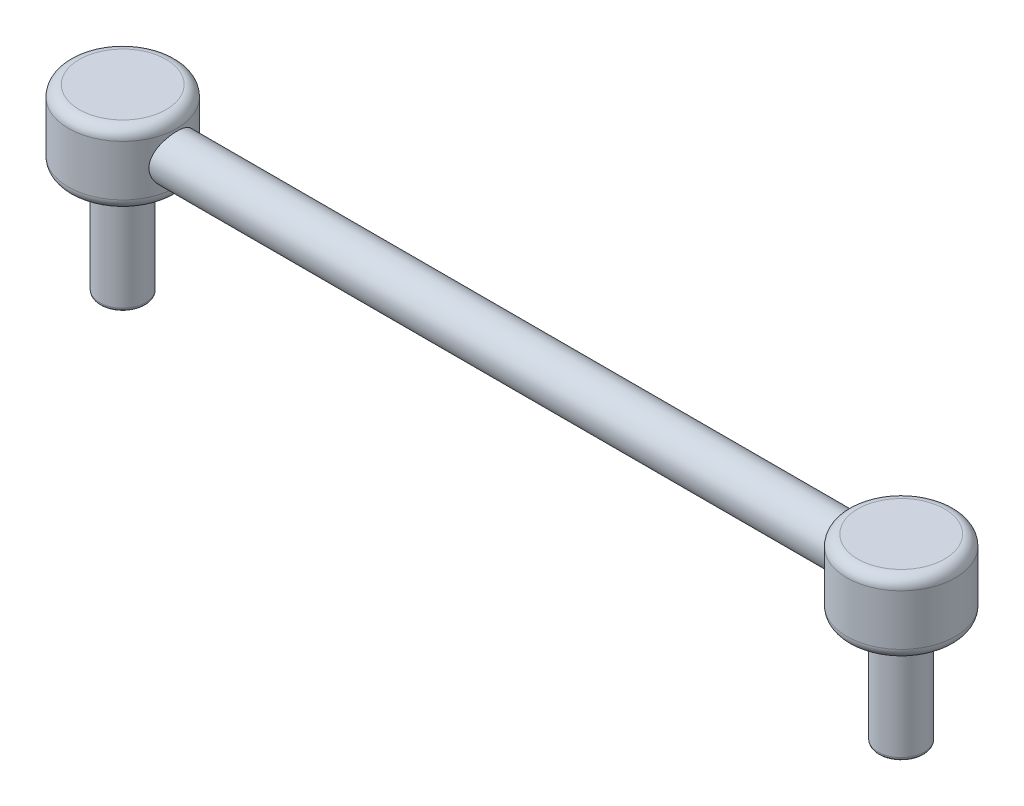
ISO-10303-21;
HEADER;
FILE_DESCRIPTION(('STEP AP214'),'2;1');
FILE_NAME('part.step','',(''),(''),'','','');
FILE_SCHEMA(('AUTOMOTIVE_DESIGN { 1 0 10303 214 1 1 1 1 }'));
ENDSEC;
DATA;
#1=APPLICATION_CONTEXT('core data for automotive mechanical design processes');
#2=APPLICATION_PROTOCOL_DEFINITION('international standard','automotive_design',2000,#1);
#3=PRODUCT_CONTEXT('',#1,'mechanical');
#4=PRODUCT('Part','Part','',(#3));
#5=PRODUCT_RELATED_PRODUCT_CATEGORY('part','',(#4));
#6=PRODUCT_DEFINITION_FORMATION('','',#4);
#7=PRODUCT_DEFINITION_CONTEXT('part definition',#1,'design');
#8=PRODUCT_DEFINITION('design','',#6,#7);
#9=PRODUCT_DEFINITION_SHAPE('','',#8);
#10=(LENGTH_UNIT() NAMED_UNIT(*) SI_UNIT(.MILLI.,.METRE.));
#11=(NAMED_UNIT(*) PLANE_ANGLE_UNIT() SI_UNIT($,.RADIAN.));
#12=(NAMED_UNIT(*) SI_UNIT($,.STERADIAN.) SOLID_ANGLE_UNIT());
#13=UNCERTAINTY_MEASURE_WITH_UNIT(LENGTH_MEASURE(1.E-05),#10,'distance_accuracy_value','');
#14=(GEOMETRIC_REPRESENTATION_CONTEXT(3) GLOBAL_UNCERTAINTY_ASSIGNED_CONTEXT((#13)) GLOBAL_UNIT_ASSIGNED_CONTEXT((#10,
#11,#12)) REPRESENTATION_CONTEXT('',''));
#15=CARTESIAN_POINT('',(0.,0.,0.));
#16=DIRECTION('',(0.,0.,1.));
#17=DIRECTION('',(1.,0.,0.));
#18=AXIS2_PLACEMENT_3D('',#15,#16,#17);
#19=CARTESIAN_POINT('',(215.,10.,0.));
#20=DIRECTION('',(-1.,0.,0.));
#21=DIRECTION('',(0.,0.,1.));
#22=AXIS2_PLACEMENT_3D('',#19,#20,#21);
#23=CYLINDRICAL_SURFACE('',#22,6.35);
#24=CARTESIAN_POINT('',(13.5896100017624,10.,6.35));
#25=CARTESIAN_POINT('',(13.5896113094437,9.83086352622694,6.34999876356606));
#26=CARTESIAN_POINT('',(13.5927785412169,9.66167017677892,6.34323262541982));
#27=CARTESIAN_POINT('',(13.6053429396222,9.32451913397667,6.31623766035786));
#28=CARTESIAN_POINT('',(13.6147440891614,9.15656230005494,6.29600022647629));
#29=CARTESIAN_POINT('',(13.6394794877049,8.82286775935023,6.24223319052705));
#30=CARTESIAN_POINT('',(13.6548261253184,8.65713543881912,6.20867583012741));
#31=CARTESIAN_POINT('',(13.6909442360392,8.32936880678683,6.128618984761));
#32=CARTESIAN_POINT('',(13.711717997605,8.16733608671491,6.08211403963384));
#33=CARTESIAN_POINT('',(13.7579192579716,7.84882512246492,5.97686722537761));
#34=CARTESIAN_POINT('',(13.7833247851926,7.6923246517361,5.91818295641476));
#35=CARTESIAN_POINT('',(13.8380953503697,7.38498804053212,5.78895801361124));
#36=CARTESIAN_POINT('',(13.8674618994433,7.23415409003246,5.71841281231731));
#37=CARTESIAN_POINT('',(13.9602332085387,6.79163355347174,5.48989532133151));
#38=CARTESIAN_POINT('',(14.0283702027229,6.50953358580105,5.31490955843452));
#39=CARTESIAN_POINT('',(14.174425468546,5.96132749451217,4.91262386633669));
#40=CARTESIAN_POINT('',(14.2526824060501,5.69711283944272,4.68286864761116));
#41=CARTESIAN_POINT('',(14.3686427293222,5.33162252409677,4.30805181606605));
#42=CARTESIAN_POINT('',(14.4070847950056,5.21486084539071,4.17798160450761));
#43=CARTESIAN_POINT('',(14.4825333310115,4.99228280587774,3.90842455364738));
#44=CARTESIAN_POINT('',(14.5195402908693,4.88646269185083,3.76894097067419));
#45=CARTESIAN_POINT('',(14.592813062566,4.68189619707006,3.47474096686708));
#46=CARTESIAN_POINT('',(14.6289683318541,4.58369158527939,3.31962009046381));
#47=CARTESIAN_POINT('',(14.6976577010502,4.40081957068304,3.00090247782828));
#48=CARTESIAN_POINT('',(14.7301931934452,4.31614695676281,2.83730903663549));
#49=CARTESIAN_POINT('',(14.7907194528053,4.16108065777849,2.50270187731384));
#50=CARTESIAN_POINT('',(14.8187108745772,4.09068491503268,2.33168923281107));
#51=CARTESIAN_POINT('',(14.8693242317261,3.96488422902279,1.98346679317648));
#52=CARTESIAN_POINT('',(14.8919465565929,3.90947819832083,1.80625744864189));
#53=CARTESIAN_POINT('',(14.9300844597461,3.81682881512302,1.45664907196768));
#54=CARTESIAN_POINT('',(14.9459154317356,3.77877251883917,1.28449970482809));
#55=CARTESIAN_POINT('',(14.9717050526133,3.71706755556464,0.93720787175087));
#56=CARTESIAN_POINT('',(14.981664094615,3.69341792407413,0.762065606989506));
#57=CARTESIAN_POINT('',(14.995422243264,3.66080391479675,0.410237555122603));
#58=CARTESIAN_POINT('',(14.9992234400147,3.65183455420383,0.233552312217178));
#59=CARTESIAN_POINT('',(15.0005615467805,3.64867335934497,-0.11997085933381));
#60=CARTESIAN_POINT('',(14.9980987089564,3.65448093022899,-0.29680878154675));
#61=CARTESIAN_POINT('',(14.987333256547,3.67997007390185,-0.638066594723042));
#62=CARTESIAN_POINT('',(14.9794086438766,3.69875377204193,-0.802566436688636));
#63=CARTESIAN_POINT('',(14.9583234171704,3.74904319585376,-1.12932358168615));
#64=CARTESIAN_POINT('',(14.9451611069026,3.78055304294667,-1.29158014059779));
#65=CARTESIAN_POINT('',(14.9139329353451,3.85597264695467,-1.61264143970686));
#66=CARTESIAN_POINT('',(14.8958686829744,3.89987833548845,-1.7714472940577));
#67=CARTESIAN_POINT('',(14.8552669361953,3.99970552998521,-2.0847074458953));
#68=CARTESIAN_POINT('',(14.8327277393335,4.05563160967159,-2.23916006161368));
#69=CARTESIAN_POINT('',(14.7833456821613,4.17993871092227,-2.54500131405314));
#70=CARTESIAN_POINT('',(14.7564437927867,4.24849262291129,-2.69631020067636));
#71=CARTESIAN_POINT('',(14.6992206081673,4.39694154254053,-2.99261190538116));
#72=CARTESIAN_POINT('',(14.668898065403,4.47684069057856,-3.13760239223012));
#73=CARTESIAN_POINT('',(14.5738428123365,4.73268829131111,-3.56186620937073));
#74=CARTESIAN_POINT('',(14.5049898509129,4.9248661706927,-3.83062558026854));
#75=CARTESIAN_POINT('',(14.3573257077404,5.36310772922074,-4.35271832191701));
#76=CARTESIAN_POINT('',(14.2781544619707,5.61206620301163,-4.60352438192189));
#77=CARTESIAN_POINT('',(14.1614823924338,6.01420434094145,-4.94642102404336));
#78=CARTESIAN_POINT('',(14.1229122459255,6.15314380309812,-5.05523391607315));
#79=CARTESIAN_POINT('',(14.0475168296569,6.43989499063994,-5.26110873594743));
#80=CARTESIAN_POINT('',(14.0106909279494,6.58770345806378,-5.35817493979546));
#81=CARTESIAN_POINT('',(13.9385838003021,6.89677777051735,-5.54311190664521));
#82=CARTESIAN_POINT('',(13.9034033654801,7.05833475082131,-5.63053566307354));
#83=CARTESIAN_POINT('',(13.837207572775,7.38905368018079,-5.79130765467297));
#84=CARTESIAN_POINT('',(13.8061905045337,7.5582124679705,-5.8646616751966));
#85=CARTESIAN_POINT('',(13.7494028884521,7.90298512939882,-5.99658921820021));
#86=CARTESIAN_POINT('',(13.7236303199901,8.07859648606163,-6.05516843526599));
#87=CARTESIAN_POINT('',(13.6782848353722,8.43500792820991,-6.15691762001397));
#88=CARTESIAN_POINT('',(13.6587113454844,8.61580753182705,-6.20008901375483));
#89=CARTESIAN_POINT('',(13.627606332412,8.96897461430324,-6.26814560157545));
#90=CARTESIAN_POINT('',(13.6156275032417,9.14110593986352,-6.29405377761598));
#91=CARTESIAN_POINT('',(13.5981822423047,9.48723781877201,-6.33165646602368));
#92=CARTESIAN_POINT('',(13.592715351499,9.66123823949155,-6.34335198026971));
#93=CARTESIAN_POINT('',(13.5884973088965,10.0096391519991,-6.3523826700149));
#94=CARTESIAN_POINT('',(13.5897441191581,10.1840395063216,-6.34972220326639));
#95=CARTESIAN_POINT('',(13.5989024104813,10.5318516209362,-6.33008457341875));
#96=CARTESIAN_POINT('',(13.6068136785779,10.7052634126398,-6.3131078677998));
#97=CARTESIAN_POINT('',(13.628258671511,11.0380947295905,-6.26667108386934));
#98=CARTESIAN_POINT('',(13.6413779999518,11.1976702606288,-6.23812841020291));
#99=CARTESIAN_POINT('',(13.6727530617345,11.513741853457,-6.16905678024264));
#100=CARTESIAN_POINT('',(13.6910104415354,11.6702369108995,-6.12852398156905));
#101=CARTESIAN_POINT('',(13.732112045029,11.979098206227,-6.03586474966169));
#102=CARTESIAN_POINT('',(13.7549554240145,12.1314651986135,-5.98374045130598));
#103=CARTESIAN_POINT('',(13.8045950283467,12.431299439306,-5.86831333125208));
#104=CARTESIAN_POINT('',(13.8313927749555,12.5787647750533,-5.80500620561725));
#105=CARTESIAN_POINT('',(13.8894329890204,12.8741443352658,-5.66477272796777));
#106=CARTESIAN_POINT('',(13.9208162071352,13.0218098605672,-5.58738094322806));
#107=CARTESIAN_POINT('',(13.9862526530586,13.3102113311169,-5.42150218055687));
#108=CARTESIAN_POINT('',(14.0203067903274,13.4509448892102,-5.33301141717302));
#109=CARTESIAN_POINT('',(14.0902070268334,13.724777169616,-5.14549100137995));
#110=CARTESIAN_POINT('',(14.1260534985069,13.8578742926801,-5.04645915372969));
#111=CARTESIAN_POINT('',(14.1986540333356,14.1157733521387,-4.83842543014553));
#112=CARTESIAN_POINT('',(14.2354081381218,14.2405749070607,-4.72942309626482));
#113=CARTESIAN_POINT('',(14.312077598224,14.491494535674,-4.49235330962767));
#114=CARTESIAN_POINT('',(14.3519966154304,14.6168260742366,-4.36345295401995));
#115=CARTESIAN_POINT('',(14.4307852739528,14.8562163773952,-4.0953570516498));
#116=CARTESIAN_POINT('',(14.4696552353114,14.9702786089086,-3.95616469432864));
#117=CARTESIAN_POINT('',(14.5453357190406,15.1864777671337,-3.66815822147476));
#118=CARTESIAN_POINT('',(14.5821451867281,15.2886086152065,-3.51933926097832));
#119=CARTESIAN_POINT('',(14.6526725840993,15.4800760812924,-3.21307708941512));
#120=CARTESIAN_POINT('',(14.686391845076,15.5694182182245,-3.05563763928718));
#121=CARTESIAN_POINT('',(14.749967054503,15.734971433373,-2.73234777909184));
#122=CARTESIAN_POINT('',(14.7798055248766,15.811123585088,-2.56646370187599));
#123=CARTESIAN_POINT('',(14.8345823294189,15.9490621269947,-2.22811991155073));
#124=CARTESIAN_POINT('',(14.8595227487113,16.0108546322184,-2.05566303401109));
#125=CARTESIAN_POINT('',(14.9037790997812,16.119443668738,-1.70543562764489));
#126=CARTESIAN_POINT('',(14.9230966471664,16.1662445079461,-1.52766664135462));
#127=CARTESIAN_POINT('',(14.9555295578416,16.2443277551651,-1.16819984332459));
#128=CARTESIAN_POINT('',(14.9686454050104,16.2756113738942,-0.986502339258985));
#129=CARTESIAN_POINT('',(14.9875655204031,16.3206013901279,-0.63386750435903));
#130=CARTESIAN_POINT('',(14.9938271583123,16.3354085904751,-0.463094325902962));
#131=CARTESIAN_POINT('',(15.0004901291828,16.3511618500637,-0.120798179277007));
#132=CARTESIAN_POINT('',(15.0008917212519,16.3521085221623,0.0507247554061957));
#133=CARTESIAN_POINT('',(14.9958241022287,16.3401316344909,0.393166905024614));
#134=CARTESIAN_POINT('',(14.9903558874365,16.3272104285575,0.564086217474903));
#135=CARTESIAN_POINT('',(14.9736991094118,16.2876455695949,0.90404461657659));
#136=CARTESIAN_POINT('',(14.9625105885938,16.2610020183129,1.07308371715974));
#137=CARTESIAN_POINT('',(14.9352399195887,16.1955419253147,1.401699959065));
#138=CARTESIAN_POINT('',(14.9193585087615,16.1572230275295,1.56139336435283));
#139=CARTESIAN_POINT('',(14.8829595373424,16.0684941670028,1.8768967750127));
#140=CARTESIAN_POINT('',(14.8624404607368,16.0180802501699,2.0327054919794));
#141=CARTESIAN_POINT('',(14.8172611105836,15.9056224196665,2.33940093902285));
#142=CARTESIAN_POINT('',(14.792601776969,15.843581145301,2.49028877698723));
#143=CARTESIAN_POINT('',(14.739697778611,15.7083328536734,2.78638469840984));
#144=CARTESIAN_POINT('',(14.7114517484811,15.6351215820574,2.93159059117741));
#145=CARTESIAN_POINT('',(14.6506744201713,15.4745347529807,3.22191163242717));
#146=CARTESIAN_POINT('',(14.6180073160019,15.3866693286758,3.36672739041029));
#147=CARTESIAN_POINT('',(14.5502296525041,15.1999282290929,3.64853826066724));
#148=CARTESIAN_POINT('',(14.5151182532278,15.1010487619186,3.7855306548198));
#149=CARTESIAN_POINT('',(14.4432866054612,14.8929100106969,4.05097290559423));
#150=CARTESIAN_POINT('',(14.4065661019448,14.783649078066,4.17942139991494));
#151=CARTESIAN_POINT('',(14.3323879336324,14.5553807997191,4.42711802903429));
#152=CARTESIAN_POINT('',(14.2949302403258,14.4363730764847,4.54636580711771));
#153=CARTESIAN_POINT('',(14.2175208983081,14.1804673708818,4.78316809401146));
#154=CARTESIAN_POINT('',(14.1775806861422,14.0428992108827,4.90000334338687));
#155=CARTESIAN_POINT('',(14.0990188521438,13.7581315832848,5.12166909944051));
#156=CARTESIAN_POINT('',(14.0603968047202,13.6109352699271,5.22650350702054));
#157=CARTESIAN_POINT('',(13.9855534103872,13.3075416924585,5.42359867795229));
#158=CARTESIAN_POINT('',(13.9493345588263,13.1513353778834,5.51584647384448));
#159=CARTESIAN_POINT('',(13.8804858963883,12.8310476404857,5.68688057946337));
#160=CARTESIAN_POINT('',(13.8478544579241,12.6669698378468,5.76567300286226));
#161=CARTESIAN_POINT('',(13.7873345017601,12.3323970328523,5.90892896814799));
#162=CARTESIAN_POINT('',(13.7594325521512,12.1619219424083,5.97343325452798));
#163=CARTESIAN_POINT('',(13.7092570642642,11.8153772985184,6.08770644134171));
#164=CARTESIAN_POINT('',(13.6869807530887,11.6393105495894,6.13748260340558));
#165=CARTESIAN_POINT('',(13.648928570795,11.2833489887038,6.22164606458007));
#166=CARTESIAN_POINT('',(13.6331355694963,11.1034656026553,6.2560739378791));
#167=CARTESIAN_POINT('',(13.6085992442422,10.7410169027455,6.30927063921159));
#168=CARTESIAN_POINT('',(13.5998504828244,10.5584537684461,6.32805154555881));
#169=CARTESIAN_POINT('',(13.5930679467907,10.3129115219451,6.34259501014289));
#170=CARTESIAN_POINT('',(13.591772156603,10.250371536304,6.34537102210961));
#171=CARTESIAN_POINT('',(13.590042936507,10.1252236326975,6.34907375775433));
#172=CARTESIAN_POINT('',(13.589609517648,10.0626157138718,6.35000045773802));
#173=CARTESIAN_POINT('',(13.5896100017624,10.,6.35));
#174=B_SPLINE_CURVE_WITH_KNOTS('',3,(#24,#25,#26,#27,#28,#29,#30,#31,#32,#33,#34,#35,#36,#37,
#38,#39,#40,#41,#42,#43,#44,#45,#46,#47,#48,#49,#50,#51,#52,#53,#54,#55,#56,#57,#58,#59,#60,#61,
#62,#63,#64,#65,#66,#67,#68,#69,#70,#71,#72,#73,#74,#75,#76,#77,#78,#79,#80,#81,#82,#83,#84,#85,
#86,#87,#88,#89,#90,#91,#92,#93,#94,#95,#96,#97,#98,#99,#100,#101,#102,#103,#104,#105,#106,#107,
#108,#109,#110,#111,#112,#113,#114,#115,#116,#117,#118,#119,#120,#121,#122,#123,#124,#125,#126,
#127,#128,#129,#130,#131,#132,#133,#134,#135,#136,#137,#138,#139,#140,#141,#142,#143,#144,#145,
#146,#147,#148,#149,#150,#151,#152,#153,#154,#155,#156,#157,#158,#159,#160,#161,#162,#163,#164,
#165,#166,#167,#168,#169,#170,#171,#172,#173),.UNSPECIFIED.,.T.,.F.,(4,2,2,2,2,2,2,2,2,2,2,2,2,
2,2,2,2,2,2,2,2,2,2,2,2,2,2,2,2,2,2,2,2,2,2,2,2,2,2,2,2,2,2,2,2,2,2,2,2,2,2,2,2,2,2,2,2,2,2,2,2,
2,2,2,2,2,2,2,2,2,2,2,2,2,4),(0.,0.507344230518969,1.01501292062567,1.5237451790304,
2.03269230208143,2.53928515805514,3.04607182715324,4.058398458171,5.12974788730966,
5.6661664023611,6.20240029821705,6.76305979482418,7.3235028608734,7.88386509448701,
8.4441866653705,8.97453898178849,9.50485578818724,10.0349925560697,10.5651079834671,
11.0617984725882,11.5586499463296,12.055338539955,12.5522164577546,13.0564853279068,
13.5609387041924,14.569217202591,15.6505265313173,16.1919586865422,16.7331931541693,
17.2935822178896,17.8537403581995,18.4136822682224,18.9735723398256,19.496324984309,
20.0190407767785,20.5415979080044,21.0641383413763,21.5514983148599,22.0390146382151,
22.5264412469333,23.0140558619771,23.5224512146578,24.0310204361713,24.5396957781239,
25.0483944953996,25.6002493868821,26.1519339722441,26.7038984078417,27.2556239225207,
27.8097540373472,28.3636477425584,28.9173821412257,29.4710733284265,29.9850080952994,
30.4989201379589,31.0127449665734,31.5265659853747,32.0209850149994,32.5155659003731,
33.0100346560355,33.5046922139704,34.021656865822,34.5388000507373,35.056025496014,
35.5732709842486,36.127182801967,36.6809140549988,37.2352115546695,37.7892565260496,
38.3417006226413,38.8938718837367,39.4445746610188,39.9948519411363,40.1826725421458,
40.3704955495908),.UNSPECIFIED.);
#175=CARTESIAN_POINT('',(13.5896100017624,10.,6.35));
#176=VERTEX_POINT('',#175);
#177=EDGE_CURVE('E89',#176,#176,#174,.T.);
#178=ORIENTED_EDGE('',*,*,#177,.T.);
#179=EDGE_LOOP('',(#178));
#180=FACE_BOUND('',#179,.T.);
#181=CARTESIAN_POINT('',(201.410389998238,10.,6.35));
#182=CARTESIAN_POINT('',(201.410388690556,9.83086352622694,6.34999876356606));
#183=CARTESIAN_POINT('',(201.407221458783,9.66167017677892,6.34323262541982));
#184=CARTESIAN_POINT('',(201.394657060378,9.32451913397668,6.31623766035787));
#185=CARTESIAN_POINT('',(201.385255910839,9.15656230005494,6.29600022647629));
#186=CARTESIAN_POINT('',(201.360520512295,8.82286775935023,6.24223319052705));
#187=CARTESIAN_POINT('',(201.345173874682,8.65713543881912,6.20867583012741));
#188=CARTESIAN_POINT('',(201.309055763961,8.32936880678683,6.128618984761));
#189=CARTESIAN_POINT('',(201.288282002395,8.16733608671491,6.08211403963384));
#190=CARTESIAN_POINT('',(201.242080742028,7.84882512246492,5.97686722537761));
#191=CARTESIAN_POINT('',(201.216675214807,7.6923246517361,5.91818295641476));
#192=CARTESIAN_POINT('',(201.16190464963,7.38498804053212,5.78895801361124));
#193=CARTESIAN_POINT('',(201.132538100557,7.23415409003246,5.71841281231731));
#194=CARTESIAN_POINT('',(201.039766791461,6.79163355347174,5.48989532133152));
#195=CARTESIAN_POINT('',(200.971629797277,6.50953358580105,5.31490955843452));
#196=CARTESIAN_POINT('',(200.825574531454,5.96132749451217,4.91262386633669));
#197=CARTESIAN_POINT('',(200.74731759395,5.69711283944272,4.68286864761116));
#198=CARTESIAN_POINT('',(200.631357270678,5.33162252409678,4.30805181606605));
#199=CARTESIAN_POINT('',(200.592915204994,5.21486084539071,4.17798160450761));
#200=CARTESIAN_POINT('',(200.517466668988,4.99228280587775,3.90842455364738));
#201=CARTESIAN_POINT('',(200.480459709131,4.88646269185083,3.76894097067419));
#202=CARTESIAN_POINT('',(200.407186937434,4.68189619707006,3.47474096686709));
#203=CARTESIAN_POINT('',(200.371031668146,4.58369158527939,3.31962009046381));
#204=CARTESIAN_POINT('',(200.30234229895,4.40081957068304,3.00090247782828));
#205=CARTESIAN_POINT('',(200.269806806555,4.31614695676281,2.83730903663549));
#206=CARTESIAN_POINT('',(200.209280547195,4.16108065777848,2.50270187731383));
#207=CARTESIAN_POINT('',(200.181289125423,4.09068491503268,2.33168923281107));
#208=CARTESIAN_POINT('',(200.130675768274,3.96488422902279,1.98346679317648));
#209=CARTESIAN_POINT('',(200.108053443407,3.90947819832083,1.80625744864189));
#210=CARTESIAN_POINT('',(200.069915540254,3.81682881512302,1.45664907196769));
#211=CARTESIAN_POINT('',(200.054084568264,3.77877251883917,1.28449970482809));
#212=CARTESIAN_POINT('',(200.028294947387,3.71706755556464,0.937207871750872));
#213=CARTESIAN_POINT('',(200.018335905385,3.69341792407413,0.762065606989507));
#214=CARTESIAN_POINT('',(200.004577756736,3.66080391479675,0.410237555122602));
#215=CARTESIAN_POINT('',(200.000776559985,3.65183455420383,0.233552312217177));
#216=CARTESIAN_POINT('',(199.999438453219,3.64867335934497,-0.119970859333812));
#217=CARTESIAN_POINT('',(200.001901291044,3.65448093022899,-0.296808781546752));
#218=CARTESIAN_POINT('',(200.012666743453,3.67997007390185,-0.638066594723044));
#219=CARTESIAN_POINT('',(200.020591356123,3.69875377204193,-0.802566436688638));
#220=CARTESIAN_POINT('',(200.04167658283,3.74904319585376,-1.12932358168615));
#221=CARTESIAN_POINT('',(200.054838893097,3.78055304294667,-1.29158014059779));
#222=CARTESIAN_POINT('',(200.086067064655,3.85597264695467,-1.61264143970686));
#223=CARTESIAN_POINT('',(200.104131317026,3.89987833548845,-1.7714472940577));
#224=CARTESIAN_POINT('',(200.144733063805,3.99970552998521,-2.0847074458953));
#225=CARTESIAN_POINT('',(200.167272260666,4.05563160967159,-2.23916006161369));
#226=CARTESIAN_POINT('',(200.216654317839,4.17993871092227,-2.54500131405314));
#227=CARTESIAN_POINT('',(200.243556207213,4.24849262291129,-2.69631020067636));
#228=CARTESIAN_POINT('',(200.300779391833,4.39694154254053,-2.99261190538116));
#229=CARTESIAN_POINT('',(200.331101934597,4.47684069057856,-3.13760239223011));
#230=CARTESIAN_POINT('',(200.426157187664,4.73268829131111,-3.56186620937073));
#231=CARTESIAN_POINT('',(200.495010149087,4.9248661706927,-3.83062558026853));
#232=CARTESIAN_POINT('',(200.64267429226,5.36310772922075,-4.35271832191702));
#233=CARTESIAN_POINT('',(200.721845538029,5.61206620301163,-4.6035243819219));
#234=CARTESIAN_POINT('',(200.838517607566,6.01420434094145,-4.94642102404336));
#235=CARTESIAN_POINT('',(200.877087754074,6.15314380309813,-5.05523391607315));
#236=CARTESIAN_POINT('',(200.952483170343,6.43989499063994,-5.26110873594743));
#237=CARTESIAN_POINT('',(200.989309072051,6.58770345806378,-5.35817493979546));
#238=CARTESIAN_POINT('',(201.061416199698,6.89677777051735,-5.54311190664521));
#239=CARTESIAN_POINT('',(201.09659663452,7.05833475082131,-5.63053566307354));
#240=CARTESIAN_POINT('',(201.162792427225,7.38905368018079,-5.79130765467297));
#241=CARTESIAN_POINT('',(201.193809495466,7.5582124679705,-5.8646616751966));
#242=CARTESIAN_POINT('',(201.250597111548,7.90298512939882,-5.99658921820021));
#243=CARTESIAN_POINT('',(201.27636968001,8.07859648606163,-6.05516843526599));
#244=CARTESIAN_POINT('',(201.321715164628,8.43500792820991,-6.15691762001397));
#245=CARTESIAN_POINT('',(201.341288654516,8.61580753182705,-6.20008901375483));
#246=CARTESIAN_POINT('',(201.372393667588,8.96897461430324,-6.26814560157545));
#247=CARTESIAN_POINT('',(201.384372496758,9.14110593986352,-6.29405377761598));
#248=CARTESIAN_POINT('',(201.401817757695,9.48723781877201,-6.33165646602368));
#249=CARTESIAN_POINT('',(201.407284648501,9.66123823949155,-6.34335198026971));
#250=CARTESIAN_POINT('',(201.411502691103,10.0096391519991,-6.3523826700149));
#251=CARTESIAN_POINT('',(201.410255880842,10.1840395063216,-6.34972220326639));
#252=CARTESIAN_POINT('',(201.401097589519,10.5318516209361,-6.33008457341875));
#253=CARTESIAN_POINT('',(201.393186321422,10.7052634126398,-6.3131078677998));
#254=CARTESIAN_POINT('',(201.371741328489,11.0380947295905,-6.26667108386934));
#255=CARTESIAN_POINT('',(201.358622000048,11.1976702606288,-6.23812841020291));
#256=CARTESIAN_POINT('',(201.327246938265,11.513741853457,-6.16905678024264));
#257=CARTESIAN_POINT('',(201.308989558465,11.6702369108995,-6.12852398156905));
#258=CARTESIAN_POINT('',(201.267887954971,11.979098206227,-6.03586474966169));
#259=CARTESIAN_POINT('',(201.245044575985,12.1314651986135,-5.98374045130599));
#260=CARTESIAN_POINT('',(201.195404971653,12.431299439306,-5.86831333125208));
#261=CARTESIAN_POINT('',(201.168607225044,12.5787647750533,-5.80500620561725));
#262=CARTESIAN_POINT('',(201.11056701098,12.8741443352658,-5.66477272796777));
#263=CARTESIAN_POINT('',(201.079183792865,13.0218098605672,-5.58738094322806));
#264=CARTESIAN_POINT('',(201.013747346941,13.3102113311169,-5.42150218055687));
#265=CARTESIAN_POINT('',(200.979693209673,13.4509448892102,-5.33301141717302));
#266=CARTESIAN_POINT('',(200.909792973167,13.724777169616,-5.14549100137995));
#267=CARTESIAN_POINT('',(200.873946501493,13.8578742926801,-5.04645915372969));
#268=CARTESIAN_POINT('',(200.801345966664,14.1157733521387,-4.83842543014553));
#269=CARTESIAN_POINT('',(200.764591861878,14.2405749070607,-4.72942309626482));
#270=CARTESIAN_POINT('',(200.687922401776,14.491494535674,-4.49235330962767));
#271=CARTESIAN_POINT('',(200.64800338457,14.6168260742366,-4.36345295401994));
#272=CARTESIAN_POINT('',(200.569214726047,14.8562163773952,-4.09535705164979));
#273=CARTESIAN_POINT('',(200.530344764689,14.9702786089086,-3.95616469432864));
#274=CARTESIAN_POINT('',(200.454664280959,15.1864777671337,-3.66815822147476));
#275=CARTESIAN_POINT('',(200.417854813272,15.2886086152065,-3.51933926097832));
#276=CARTESIAN_POINT('',(200.347327415901,15.4800760812924,-3.21307708941513));
#277=CARTESIAN_POINT('',(200.313608154924,15.5694182182245,-3.05563763928718));
#278=CARTESIAN_POINT('',(200.250032945497,15.734971433373,-2.73234777909184));
#279=CARTESIAN_POINT('',(200.220194475123,15.811123585088,-2.56646370187599));
#280=CARTESIAN_POINT('',(200.165417670581,15.9490621269947,-2.22811991155073));
#281=CARTESIAN_POINT('',(200.140477251289,16.0108546322184,-2.05566303401109));
#282=CARTESIAN_POINT('',(200.096220900219,16.119443668738,-1.70543562764489));
#283=CARTESIAN_POINT('',(200.076903352834,16.1662445079461,-1.52766664135462));
#284=CARTESIAN_POINT('',(200.044470442158,16.2443277551651,-1.16819984332459));
#285=CARTESIAN_POINT('',(200.03135459499,16.2756113738942,-0.986502339258985));
#286=CARTESIAN_POINT('',(200.012434479597,16.3206013901279,-0.633867504359032));
#287=CARTESIAN_POINT('',(200.006172841688,16.3354085904751,-0.463094325902964));
#288=CARTESIAN_POINT('',(199.999509870817,16.3511618500637,-0.12079817927701));
#289=CARTESIAN_POINT('',(199.999108278748,16.3521085221623,0.0507247554061937));
#290=CARTESIAN_POINT('',(200.004175897771,16.3401316344909,0.393166905024613));
#291=CARTESIAN_POINT('',(200.009644112564,16.3272104285576,0.564086217474904));
#292=CARTESIAN_POINT('',(200.026300890588,16.2876455695949,0.90404461657659));
#293=CARTESIAN_POINT('',(200.037489411406,16.2610020183129,1.07308371715974));
#294=CARTESIAN_POINT('',(200.064760080411,16.1955419253147,1.401699959065));
#295=CARTESIAN_POINT('',(200.080641491238,16.1572230275295,1.56139336435282));
#296=CARTESIAN_POINT('',(200.117040462658,16.0684941670028,1.87689677501269));
#297=CARTESIAN_POINT('',(200.137559539263,16.0180802501699,2.0327054919794));
#298=CARTESIAN_POINT('',(200.182738889416,15.9056224196665,2.33940093902285));
#299=CARTESIAN_POINT('',(200.207398223031,15.843581145301,2.49028877698723));
#300=CARTESIAN_POINT('',(200.260302221389,15.7083328536734,2.78638469840984));
#301=CARTESIAN_POINT('',(200.288548251519,15.6351215820574,2.93159059117742));
#302=CARTESIAN_POINT('',(200.349325579829,15.4745347529807,3.22191163242717));
#303=CARTESIAN_POINT('',(200.381992683998,15.3866693286758,3.36672739041029));
#304=CARTESIAN_POINT('',(200.449770347496,15.1999282290929,3.64853826066724));
#305=CARTESIAN_POINT('',(200.484881746772,15.1010487619186,3.7855306548198));
#306=CARTESIAN_POINT('',(200.556713394539,14.8929100106969,4.05097290559423));
#307=CARTESIAN_POINT('',(200.593433898055,14.783649078066,4.17942139991495));
#308=CARTESIAN_POINT('',(200.667612066368,14.5553807997191,4.42711802903429));
#309=CARTESIAN_POINT('',(200.705069759674,14.4363730764847,4.54636580711771));
#310=CARTESIAN_POINT('',(200.782479101692,14.1804673708818,4.78316809401146));
#311=CARTESIAN_POINT('',(200.822419313858,14.0428992108827,4.90000334338687));
#312=CARTESIAN_POINT('',(200.900981147856,13.7581315832848,5.12166909944052));
#313=CARTESIAN_POINT('',(200.93960319528,13.6109352699271,5.22650350702054));
#314=CARTESIAN_POINT('',(201.014446589613,13.3075416924585,5.42359867795229));
#315=CARTESIAN_POINT('',(201.050665441174,13.1513353778834,5.51584647384448));
#316=CARTESIAN_POINT('',(201.119514103612,12.8310476404857,5.68688057946337));
#317=CARTESIAN_POINT('',(201.152145542076,12.6669698378468,5.76567300286226));
#318=CARTESIAN_POINT('',(201.21266549824,12.3323970328523,5.90892896814799));
#319=CARTESIAN_POINT('',(201.240567447849,12.1619219424083,5.97343325452798));
#320=CARTESIAN_POINT('',(201.290742935736,11.8153772985184,6.08770644134172));
#321=CARTESIAN_POINT('',(201.313019246911,11.6393105495894,6.13748260340558));
#322=CARTESIAN_POINT('',(201.351071429205,11.2833489887038,6.22164606458007));
#323=CARTESIAN_POINT('',(201.366864430504,11.1034656026553,6.2560739378791));
#324=CARTESIAN_POINT('',(201.391400755758,10.7410169027455,6.30927063921159));
#325=CARTESIAN_POINT('',(201.400149517176,10.5584537684461,6.32805154555881));
#326=CARTESIAN_POINT('',(201.406932053209,10.3129115219451,6.34259501014289));
#327=CARTESIAN_POINT('',(201.408227843397,10.250371536304,6.34537102210961));
#328=CARTESIAN_POINT('',(201.409957063493,10.1252236326975,6.34907375775433));
#329=CARTESIAN_POINT('',(201.410390482352,10.0626157138718,6.35000045773802));
#330=CARTESIAN_POINT('',(201.410389998238,10.,6.35));
#331=B_SPLINE_CURVE_WITH_KNOTS('',3,(#181,#182,#183,#184,#185,#186,#187,#188,#189,#190,#191,
#192,#193,#194,#195,#196,#197,#198,#199,#200,#201,#202,#203,#204,#205,#206,#207,#208,#209,#210,
#211,#212,#213,#214,#215,#216,#217,#218,#219,#220,#221,#222,#223,#224,#225,#226,#227,#228,#229,
#230,#231,#232,#233,#234,#235,#236,#237,#238,#239,#240,#241,#242,#243,#244,#245,#246,#247,#248,
#249,#250,#251,#252,#253,#254,#255,#256,#257,#258,#259,#260,#261,#262,#263,#264,#265,#266,#267,
#268,#269,#270,#271,#272,#273,#274,#275,#276,#277,#278,#279,#280,#281,#282,#283,#284,#285,#286,
#287,#288,#289,#290,#291,#292,#293,#294,#295,#296,#297,#298,#299,#300,#301,#302,#303,#304,#305,
#306,#307,#308,#309,#310,#311,#312,#313,#314,#315,#316,#317,#318,#319,#320,#321,#322,#323,#324,
#325,#326,#327,#328,#329,#330),.UNSPECIFIED.,.T.,.F.,(4,2,2,2,2,2,2,2,2,2,2,2,2,2,2,2,2,2,2,2,2,
2,2,2,2,2,2,2,2,2,2,2,2,2,2,2,2,2,2,2,2,2,2,2,2,2,2,2,2,2,2,2,2,2,2,2,2,2,2,2,2,2,2,2,2,2,2,2,2,
2,2,2,2,2,4),(0.,0.507344230518965,1.01501292062566,1.5237451790304,2.03269230208143,
2.53928515805514,3.04607182715324,4.058398458171,5.12974788730965,5.66616640236109,
6.20240029821704,6.76305979482418,7.3235028608734,7.88386509448701,8.44418666537049,
8.97453898178849,9.50485578818724,10.0349925560697,10.5651079834671,11.0617984725882,
11.5586499463296,12.055338539955,12.5522164577546,13.0564853279068,13.5609387041924,
14.569217202591,15.6505265313173,16.1919586865422,16.7331931541693,17.2935822178896,
17.8537403581995,18.4136822682223,18.9735723398256,19.496324984309,20.0190407767785,
20.5415979080044,21.0641383413763,21.5514983148599,22.0390146382151,22.5264412469333,
23.0140558619771,23.5224512146577,24.0310204361713,24.5396957781239,25.0483944953996,
25.6002493868821,26.1519339722441,26.7038984078417,27.2556239225207,27.8097540373472,
28.3636477425584,28.9173821412257,29.4710733284265,29.9850080952994,30.4989201379589,
31.0127449665733,31.5265659853747,32.0209850149994,32.5155659003731,33.0100346560355,
33.5046922139704,34.021656865822,34.5388000507373,35.056025496014,35.5732709842486,
36.127182801967,36.6809140549988,37.2352115546695,37.7892565260496,38.3417006226413,
38.8938718837367,39.4445746610188,39.9948519411363,40.1826725421458,40.3704955495908),.UNSPECIFIED.);
#332=CARTESIAN_POINT('',(201.410389998238,10.,6.35));
#333=VERTEX_POINT('',#332);
#334=EDGE_CURVE('E81',#333,#333,#331,.T.);
#335=ORIENTED_EDGE('',*,*,#334,.F.);
#336=EDGE_LOOP('',(#335));
#337=FACE_BOUND('',#336,.T.);
#338=ADVANCED_FACE('F37',(#180,#337),#23,.T.);
#339=CARTESIAN_POINT('',(0.,20.,0.));
#340=DIRECTION('',(0.,-1.,0.));
#341=DIRECTION('',(0.,0.,-1.));
#342=AXIS2_PLACEMENT_3D('',#339,#340,#341);
#343=CYLINDRICAL_SURFACE('',#342,15.);
#344=CARTESIAN_POINT('',(0.,3.,0.));
#345=DIRECTION('',(0.,1.,0.));
#346=DIRECTION('',(0.,0.,1.));
#347=AXIS2_PLACEMENT_3D('',#344,#345,#346);
#348=CIRCLE('',#347,15.);
#349=CARTESIAN_POINT('',(0.,3.,15.));
#350=VERTEX_POINT('',#349);
#351=EDGE_CURVE('E66',#350,#350,#348,.T.);
#352=ORIENTED_EDGE('',*,*,#351,.T.);
#353=EDGE_LOOP('',(#352));
#354=FACE_BOUND('',#353,.T.);
#355=CARTESIAN_POINT('',(0.,17.,0.));
#356=DIRECTION('',(0.,1.,0.));
#357=DIRECTION('',(0.,0.,1.));
#358=AXIS2_PLACEMENT_3D('',#355,#356,#357);
#359=CIRCLE('',#358,15.);
#360=CARTESIAN_POINT('',(0.,17.,15.));
#361=VERTEX_POINT('',#360);
#362=EDGE_CURVE('E69',#361,#361,#359,.F.);
#363=ORIENTED_EDGE('',*,*,#362,.T.);
#364=EDGE_LOOP('',(#363));
#365=FACE_BOUND('',#364,.T.);
#366=ORIENTED_EDGE('',*,*,#177,.F.);
#367=EDGE_LOOP('',(#366));
#368=FACE_BOUND('',#367,.T.);
#369=ADVANCED_FACE('F118',(#354,#365,#368),#343,.T.);
#370=CARTESIAN_POINT('',(0.,-30.,0.));
#371=DIRECTION('',(0.,1.,0.));
#372=DIRECTION('',(0.,0.,1.));
#373=AXIS2_PLACEMENT_3D('',#370,#371,#372);
#374=CYLINDRICAL_SURFACE('',#373,6.35);
#375=CARTESIAN_POINT('',(0.,-29.,0.));
#376=DIRECTION('',(0.,1.,0.));
#377=DIRECTION('',(0.,0.,1.));
#378=AXIS2_PLACEMENT_3D('',#375,#376,#377);
#379=CIRCLE('',#378,6.35);
#380=CARTESIAN_POINT('',(0.,-29.,6.35));
#381=VERTEX_POINT('',#380);
#382=EDGE_CURVE('E44',#381,#381,#379,.T.);
#383=ORIENTED_EDGE('',*,*,#382,.T.);
#384=EDGE_LOOP('',(#383));
#385=FACE_BOUND('',#384,.T.);
#386=CARTESIAN_POINT('',(0.,0.,0.));
#387=DIRECTION('',(0.,1.,0.));
#388=DIRECTION('',(0.,0.,1.));
#389=AXIS2_PLACEMENT_3D('',#386,#387,#388);
#390=CIRCLE('',#389,6.35);
#391=CARTESIAN_POINT('',(0.,0.,6.35));
#392=VERTEX_POINT('',#391);
#393=EDGE_CURVE('E131',#392,#392,#390,.T.);
#394=ORIENTED_EDGE('',*,*,#393,.F.);
#395=EDGE_LOOP('',(#394));
#396=FACE_BOUND('',#395,.T.);
#397=ADVANCED_FACE('F123',(#385,#396),#374,.T.);
#398=CARTESIAN_POINT('',(0.,-30.,0.));
#399=DIRECTION('',(0.,1.,0.));
#400=DIRECTION('',(0.,0.,1.));
#401=AXIS2_PLACEMENT_3D('',#398,#399,#400);
#402=PLANE('',#401);
#403=CARTESIAN_POINT('',(0.,-30.,0.));
#404=DIRECTION('',(0.,1.,0.));
#405=DIRECTION('',(0.,0.,1.));
#406=AXIS2_PLACEMENT_3D('',#403,#404,#405);
#407=CIRCLE('',#406,5.35);
#408=CARTESIAN_POINT('',(0.,-30.,5.35));
#409=VERTEX_POINT('',#408);
#410=EDGE_CURVE('E10',#409,#409,#407,.F.);
#411=ORIENTED_EDGE('',*,*,#410,.T.);
#412=EDGE_LOOP('',(#411));
#413=FACE_BOUND('',#412,.T.);
#414=ADVANCED_FACE('F177',(#413),#402,.F.);
#415=CARTESIAN_POINT('',(0.,20.,0.));
#416=DIRECTION('',(0.,1.,0.));
#417=DIRECTION('',(0.,0.,1.));
#418=AXIS2_PLACEMENT_3D('',#415,#416,#417);
#419=PLANE('',#418);
#420=CARTESIAN_POINT('',(0.,20.,0.));
#421=DIRECTION('',(0.,1.,0.));
#422=DIRECTION('',(0.,0.,1.));
#423=AXIS2_PLACEMENT_3D('',#420,#421,#422);
#424=CIRCLE('',#423,12.);
#425=CARTESIAN_POINT('',(0.,20.,12.));
#426=VERTEX_POINT('',#425);
#427=EDGE_CURVE('E60',#426,#426,#424,.T.);
#428=ORIENTED_EDGE('',*,*,#427,.T.);
#429=EDGE_LOOP('',(#428));
#430=FACE_BOUND('',#429,.T.);
#431=ADVANCED_FACE('F179',(#430),#419,.T.);
#432=CARTESIAN_POINT('',(0.,0.,0.));
#433=DIRECTION('',(0.,1.,0.));
#434=DIRECTION('',(0.,0.,1.));
#435=AXIS2_PLACEMENT_3D('',#432,#433,#434);
#436=PLANE('',#435);
#437=CARTESIAN_POINT('',(0.,0.,0.));
#438=DIRECTION('',(0.,1.,0.));
#439=DIRECTION('',(0.,0.,1.));
#440=AXIS2_PLACEMENT_3D('',#437,#438,#439);
#441=CIRCLE('',#440,12.);
#442=CARTESIAN_POINT('',(0.,0.,12.));
#443=VERTEX_POINT('',#442);
#444=EDGE_CURVE('E63',#443,#443,#441,.F.);
#445=ORIENTED_EDGE('',*,*,#444,.T.);
#446=EDGE_LOOP('',(#445));
#447=FACE_BOUND('',#446,.T.);
#448=ORIENTED_EDGE('',*,*,#393,.T.);
#449=EDGE_LOOP('',(#448));
#450=FACE_BOUND('',#449,.T.);
#451=ADVANCED_FACE('F104',(#447,#450),#436,.F.);
#452=CARTESIAN_POINT('',(215.,20.,0.));
#453=DIRECTION('',(0.,-1.,0.));
#454=DIRECTION('',(0.,0.,-1.));
#455=AXIS2_PLACEMENT_3D('',#452,#453,#454);
#456=CYLINDRICAL_SURFACE('',#455,15.);
#457=CARTESIAN_POINT('',(215.,3.,0.));
#458=DIRECTION('',(0.,1.,0.));
#459=DIRECTION('',(0.,0.,1.));
#460=AXIS2_PLACEMENT_3D('',#457,#458,#459);
#461=CIRCLE('',#460,15.);
#462=CARTESIAN_POINT('',(215.,3.,15.));
#463=VERTEX_POINT('',#462);
#464=EDGE_CURVE('E75',#463,#463,#461,.T.);
#465=ORIENTED_EDGE('',*,*,#464,.T.);
#466=EDGE_LOOP('',(#465));
#467=FACE_BOUND('',#466,.T.);
#468=CARTESIAN_POINT('',(215.,17.,0.));
#469=DIRECTION('',(0.,1.,0.));
#470=DIRECTION('',(0.,0.,1.));
#471=AXIS2_PLACEMENT_3D('',#468,#469,#470);
#472=CIRCLE('',#471,15.);
#473=CARTESIAN_POINT('',(215.,17.,15.));
#474=VERTEX_POINT('',#473);
#475=EDGE_CURVE('E78',#474,#474,#472,.F.);
#476=ORIENTED_EDGE('',*,*,#475,.T.);
#477=EDGE_LOOP('',(#476));
#478=FACE_BOUND('',#477,.T.);
#479=ORIENTED_EDGE('',*,*,#334,.T.);
#480=EDGE_LOOP('',(#479));
#481=FACE_BOUND('',#480,.T.);
#482=ADVANCED_FACE('F98',(#467,#478,#481),#456,.T.);
#483=CARTESIAN_POINT('',(215.,-30.,0.));
#484=DIRECTION('',(0.,1.,0.));
#485=DIRECTION('',(0.,0.,1.));
#486=AXIS2_PLACEMENT_3D('',#483,#484,#485);
#487=CYLINDRICAL_SURFACE('',#486,6.35);
#488=CARTESIAN_POINT('',(215.,-29.,0.));
#489=DIRECTION('',(0.,1.,0.));
#490=DIRECTION('',(0.,0.,1.));
#491=AXIS2_PLACEMENT_3D('',#488,#489,#490);
#492=CIRCLE('',#491,6.35);
#493=CARTESIAN_POINT('',(215.,-29.,6.35));
#494=VERTEX_POINT('',#493);
#495=EDGE_CURVE('E52',#494,#494,#492,.T.);
#496=ORIENTED_EDGE('',*,*,#495,.T.);
#497=EDGE_LOOP('',(#496));
#498=FACE_BOUND('',#497,.T.);
#499=CARTESIAN_POINT('',(215.,0.,0.));
#500=DIRECTION('',(0.,1.,0.));
#501=DIRECTION('',(0.,0.,1.));
#502=AXIS2_PLACEMENT_3D('',#499,#500,#501);
#503=CIRCLE('',#502,6.35);
#504=CARTESIAN_POINT('',(215.,0.,6.35));
#505=VERTEX_POINT('',#504);
#506=EDGE_CURVE('E133',#505,#505,#503,.T.);
#507=ORIENTED_EDGE('',*,*,#506,.F.);
#508=EDGE_LOOP('',(#507));
#509=FACE_BOUND('',#508,.T.);
#510=ADVANCED_FACE('F103',(#498,#509),#487,.T.);
#511=CARTESIAN_POINT('',(215.,-30.,0.));
#512=DIRECTION('',(0.,1.,0.));
#513=DIRECTION('',(0.,0.,1.));
#514=AXIS2_PLACEMENT_3D('',#511,#512,#513);
#515=PLANE('',#514);
#516=CARTESIAN_POINT('',(215.,-30.,0.));
#517=DIRECTION('',(0.,1.,0.));
#518=DIRECTION('',(0.,0.,1.));
#519=AXIS2_PLACEMENT_3D('',#516,#517,#518);
#520=CIRCLE('',#519,5.35);
#521=CARTESIAN_POINT('',(215.,-30.,5.35));
#522=VERTEX_POINT('',#521);
#523=EDGE_CURVE('E48',#522,#522,#520,.F.);
#524=ORIENTED_EDGE('',*,*,#523,.T.);
#525=EDGE_LOOP('',(#524));
#526=FACE_BOUND('',#525,.T.);
#527=ADVANCED_FACE('F108',(#526),#515,.F.);
#528=CARTESIAN_POINT('',(215.,20.,0.));
#529=DIRECTION('',(0.,1.,0.));
#530=DIRECTION('',(0.,0.,1.));
#531=AXIS2_PLACEMENT_3D('',#528,#529,#530);
#532=PLANE('',#531);
#533=CARTESIAN_POINT('',(215.,20.,0.));
#534=DIRECTION('',(0.,1.,0.));
#535=DIRECTION('',(0.,0.,1.));
#536=AXIS2_PLACEMENT_3D('',#533,#534,#535);
#537=CIRCLE('',#536,12.);
#538=CARTESIAN_POINT('',(215.,20.,12.));
#539=VERTEX_POINT('',#538);
#540=EDGE_CURVE('E57',#539,#539,#537,.T.);
#541=ORIENTED_EDGE('',*,*,#540,.T.);
#542=EDGE_LOOP('',(#541));
#543=FACE_BOUND('',#542,.T.);
#544=ADVANCED_FACE('F110',(#543),#532,.T.);
#545=CARTESIAN_POINT('',(215.,0.,0.));
#546=DIRECTION('',(0.,1.,0.));
#547=DIRECTION('',(0.,0.,1.));
#548=AXIS2_PLACEMENT_3D('',#545,#546,#547);
#549=PLANE('',#548);
#550=CARTESIAN_POINT('',(215.,0.,0.));
#551=DIRECTION('',(0.,1.,0.));
#552=DIRECTION('',(0.,0.,1.));
#553=AXIS2_PLACEMENT_3D('',#550,#551,#552);
#554=CIRCLE('',#553,12.);
#555=CARTESIAN_POINT('',(215.,0.,12.));
#556=VERTEX_POINT('',#555);
#557=EDGE_CURVE('E72',#556,#556,#554,.F.);
#558=ORIENTED_EDGE('',*,*,#557,.T.);
#559=EDGE_LOOP('',(#558));
#560=FACE_BOUND('',#559,.T.);
#561=ORIENTED_EDGE('',*,*,#506,.T.);
#562=EDGE_LOOP('',(#561));
#563=FACE_BOUND('',#562,.T.);
#564=ADVANCED_FACE('F106',(#560,#563),#549,.F.);
#565=CARTESIAN_POINT('',(215.,3.,0.));
#566=DIRECTION('',(0.,1.,0.));
#567=DIRECTION('',(0.,0.,1.));
#568=AXIS2_PLACEMENT_3D('',#565,#566,#567);
#569=TOROIDAL_SURFACE('',#568,12.,3.);
#570=ORIENTED_EDGE('',*,*,#557,.F.);
#571=EDGE_LOOP('',(#570));
#572=FACE_BOUND('',#571,.T.);
#573=ORIENTED_EDGE('',*,*,#464,.F.);
#574=EDGE_LOOP('',(#573));
#575=FACE_BOUND('',#574,.T.);
#576=ADVANCED_FACE('F141',(#572,#575),#569,.T.);
#577=CARTESIAN_POINT('',(0.,3.,0.));
#578=DIRECTION('',(0.,1.,0.));
#579=DIRECTION('',(0.,0.,1.));
#580=AXIS2_PLACEMENT_3D('',#577,#578,#579);
#581=TOROIDAL_SURFACE('',#580,12.,3.);
#582=ORIENTED_EDGE('',*,*,#444,.F.);
#583=EDGE_LOOP('',(#582));
#584=FACE_BOUND('',#583,.T.);
#585=ORIENTED_EDGE('',*,*,#351,.F.);
#586=EDGE_LOOP('',(#585));
#587=FACE_BOUND('',#586,.T.);
#588=ADVANCED_FACE('F147',(#584,#587),#581,.T.);
#589=CARTESIAN_POINT('',(0.,17.,0.));
#590=DIRECTION('',(0.,1.,0.));
#591=DIRECTION('',(0.,0.,1.));
#592=AXIS2_PLACEMENT_3D('',#589,#590,#591);
#593=TOROIDAL_SURFACE('',#592,12.,3.);
#594=ORIENTED_EDGE('',*,*,#362,.F.);
#595=EDGE_LOOP('',(#594));
#596=FACE_BOUND('',#595,.T.);
#597=ORIENTED_EDGE('',*,*,#427,.F.);
#598=EDGE_LOOP('',(#597));
#599=FACE_BOUND('',#598,.T.);
#600=ADVANCED_FACE('F161',(#596,#599),#593,.T.);
#601=CARTESIAN_POINT('',(215.,17.,0.));
#602=DIRECTION('',(0.,1.,0.));
#603=DIRECTION('',(0.,0.,1.));
#604=AXIS2_PLACEMENT_3D('',#601,#602,#603);
#605=TOROIDAL_SURFACE('',#604,12.,3.);
#606=ORIENTED_EDGE('',*,*,#475,.F.);
#607=EDGE_LOOP('',(#606));
#608=FACE_BOUND('',#607,.T.);
#609=ORIENTED_EDGE('',*,*,#540,.F.);
#610=EDGE_LOOP('',(#609));
#611=FACE_BOUND('',#610,.T.);
#612=ADVANCED_FACE('F157',(#608,#611),#605,.T.);
#613=CARTESIAN_POINT('',(215.,-29.,0.));
#614=DIRECTION('',(0.,1.,0.));
#615=DIRECTION('',(0.,0.,1.));
#616=AXIS2_PLACEMENT_3D('',#613,#614,#615);
#617=TOROIDAL_SURFACE('',#616,5.35,1.);
#618=ORIENTED_EDGE('',*,*,#523,.F.);
#619=EDGE_LOOP('',(#618));
#620=FACE_BOUND('',#619,.T.);
#621=ORIENTED_EDGE('',*,*,#495,.F.);
#622=EDGE_LOOP('',(#621));
#623=FACE_BOUND('',#622,.T.);
#624=ADVANCED_FACE('F160',(#620,#623),#617,.T.);
#625=CARTESIAN_POINT('',(0.,-29.,0.));
#626=DIRECTION('',(0.,1.,0.));
#627=DIRECTION('',(0.,0.,1.));
#628=AXIS2_PLACEMENT_3D('',#625,#626,#627);
#629=TOROIDAL_SURFACE('',#628,5.35,1.);
#630=ORIENTED_EDGE('',*,*,#410,.F.);
#631=EDGE_LOOP('',(#630));
#632=FACE_BOUND('',#631,.T.);
#633=ORIENTED_EDGE('',*,*,#382,.F.);
#634=EDGE_LOOP('',(#633));
#635=FACE_BOUND('',#634,.T.);
#636=ADVANCED_FACE('F39',(#632,#635),#629,.T.);
#637=CLOSED_SHELL('',(#338,#369,#397,#414,#431,#451,#482,#510,#527,#544,#564,#576,#588,#600,
#612,#624,#636));
#638=MANIFOLD_SOLID_BREP('B2',#637);
#639=ADVANCED_BREP_SHAPE_REPRESENTATION('',(#18,#638),#14);
#640=SHAPE_DEFINITION_REPRESENTATION(#9,#639);
ENDSEC;
END-ISO-10303-21;
